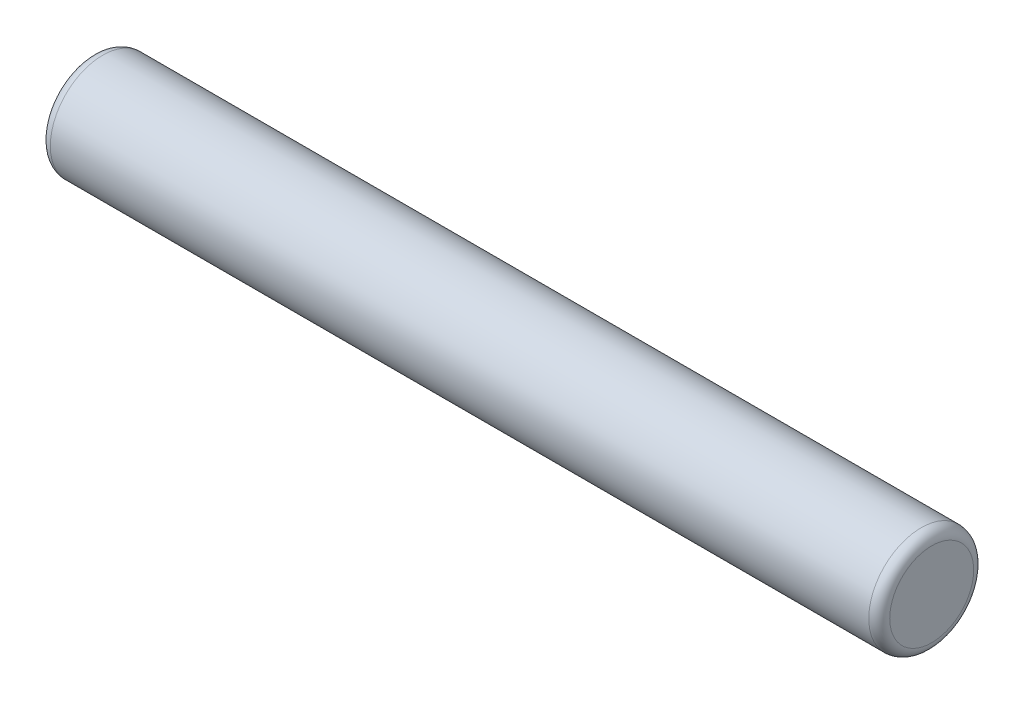
ISO-10303-21;
HEADER;
FILE_DESCRIPTION(('STEP AP214'),'2;1');
FILE_NAME('part.step','',(''),(''),'','','');
FILE_SCHEMA(('AUTOMOTIVE_DESIGN { 1 0 10303 214 1 1 1 1 }'));
ENDSEC;
DATA;
#1=APPLICATION_CONTEXT('core data for automotive mechanical design processes');
#2=APPLICATION_PROTOCOL_DEFINITION('international standard','automotive_design',2000,#1);
#3=PRODUCT_CONTEXT('',#1,'mechanical');
#4=PRODUCT('Part','Part','',(#3));
#5=PRODUCT_RELATED_PRODUCT_CATEGORY('part','',(#4));
#6=PRODUCT_DEFINITION_FORMATION('','',#4);
#7=PRODUCT_DEFINITION_CONTEXT('part definition',#1,'design');
#8=PRODUCT_DEFINITION('design','',#6,#7);
#9=PRODUCT_DEFINITION_SHAPE('','',#8);
#10=(LENGTH_UNIT() NAMED_UNIT(*) SI_UNIT(.MILLI.,.METRE.));
#11=(NAMED_UNIT(*) PLANE_ANGLE_UNIT() SI_UNIT($,.RADIAN.));
#12=(NAMED_UNIT(*) SI_UNIT($,.STERADIAN.) SOLID_ANGLE_UNIT());
#13=UNCERTAINTY_MEASURE_WITH_UNIT(LENGTH_MEASURE(1.E-05),#10,'distance_accuracy_value','');
#14=(GEOMETRIC_REPRESENTATION_CONTEXT(3) GLOBAL_UNCERTAINTY_ASSIGNED_CONTEXT((#13)) GLOBAL_UNIT_ASSIGNED_CONTEXT((#10,
#11,#12)) REPRESENTATION_CONTEXT('',''));
#15=CARTESIAN_POINT('',(0.,0.,0.));
#16=DIRECTION('',(0.,0.,1.));
#17=DIRECTION('',(1.,0.,0.));
#18=AXIS2_PLACEMENT_3D('',#15,#16,#17);
#19=CARTESIAN_POINT('',(10.,24.,0.));
#20=DIRECTION('',(-1.,0.,0.));
#21=DIRECTION('',(0.,-1.,0.));
#22=AXIS2_PLACEMENT_3D('',#19,#20,#21);
#23=PLANE('',#22);
#24=CARTESIAN_POINT('',(10.,24.1168813269704,0.993145888279073));
#25=CARTESIAN_POINT('',(10.,24.1277148782153,0.991870978667544));
#26=CARTESIAN_POINT('',(10.,24.1385275480753,0.99041867227362));
#27=CARTESIAN_POINT('',(10.,24.1600995915585,0.987161119156834));
#28=CARTESIAN_POINT('',(10.,24.1708589651818,0.985355872433971));
#29=CARTESIAN_POINT('',(10.,24.1923128827241,0.981394291895155));
#30=CARTESIAN_POINT('',(10.,24.2030074266432,0.979237958079202));
#31=CARTESIAN_POINT('',(10.,24.2243202360235,0.974576533810914));
#32=CARTESIAN_POINT('',(10.,24.2349385014846,0.972071443358578));
#33=CARTESIAN_POINT('',(10.,24.2560873827783,0.966715182596895));
#34=CARTESIAN_POINT('',(10.,24.266617998611,0.963864012287546));
#35=CARTESIAN_POINT('',(10.,24.2875803044325,0.9578186464529));
#36=CARTESIAN_POINT('',(10.,24.2980119944214,0.954624450927603));
#37=CARTESIAN_POINT('',(10.,24.3187652779785,0.947896454673936));
#38=CARTESIAN_POINT('',(10.,24.3290868715466,0.944362653945565));
#39=CARTESIAN_POINT('',(10.,24.3496089096579,0.936959231478396));
#40=CARTESIAN_POINT('',(10.,24.359809354201,0.933089609739598));
#41=CARTESIAN_POINT('',(10.,24.3800781713662,0.925018688909898));
#42=CARTESIAN_POINT('',(10.,24.3901465439882,0.920817389818996));
#43=CARTESIAN_POINT('',(10.,24.410140435847,0.912087613149304));
#44=CARTESIAN_POINT('',(10.,24.4200659550836,0.907559135570515));
#45=CARTESIAN_POINT('',(10.,24.4397635116766,0.898179851130146));
#46=CARTESIAN_POINT('',(10.,24.449535549033,0.893329044268566));
#47=CARTESIAN_POINT('',(10.,24.468915677723,0.883310295628669));
#48=CARTESIAN_POINT('',(10.,24.4785237690567,0.878142353850352));
#49=CARTESIAN_POINT('',(10.,24.4975657171166,0.867494869338329));
#50=CARTESIAN_POINT('',(10.,24.5069995738428,0.862015326604623));
#51=CARTESIAN_POINT('',(10.,24.5256829506777,0.85075050781347));
#52=CARTESIAN_POINT('',(10.,24.5349324707863,0.844965231756023));
#53=CARTESIAN_POINT('',(10.,24.5532372697683,0.833095141335883));
#54=CARTESIAN_POINT('',(10.,24.5622925486415,0.82701032697319));
#55=CARTESIAN_POINT('',(10.,24.5801991685333,0.81454767571419));
#56=CARTESIAN_POINT('',(10.,24.5890505095517,0.808169838817884));
#57=CARTESIAN_POINT('',(10.,24.6065397754962,0.795127972039151));
#58=CARTESIAN_POINT('',(10.,24.6151777004222,0.788463942156724));
#59=CARTESIAN_POINT('',(10.,24.6322308844754,0.774856825415867));
#60=CARTESIAN_POINT('',(10.,24.6406461436026,0.767913738557435));
#61=CARTESIAN_POINT('',(10.,24.6572449847878,0.75375594269588));
#62=CARTESIAN_POINT('',(10.,24.6654285668459,0.746541233692756));
#63=CARTESIAN_POINT('',(10.,24.6815552907083,0.731847919232927));
#64=CARTESIAN_POINT('',(10.,24.6894984325127,0.724369313776222));
#65=CARTESIAN_POINT('',(10.,24.7051357701525,0.70915621468727));
#66=CARTESIAN_POINT('',(10.,24.7128299659879,0.701421721055022));
#67=CARTESIAN_POINT('',(10.,24.7279611725522,0.685705127904497));
#68=CARTESIAN_POINT('',(10.,24.7353981832811,0.677723028386218));
#69=CARTESIAN_POINT('',(10.,24.7500070558949,0.661519770895724));
#70=CARTESIAN_POINT('',(10.,24.7571789177799,0.653298612923508));
#71=CARTESIAN_POINT('',(10.,24.7712498128965,0.636626041947013));
#72=CARTESIAN_POINT('',(10.,24.7781488461283,0.628174628942734));
#73=CARTESIAN_POINT('',(10.,24.7916666962808,0.611050597886841));
#74=CARTESIAN_POINT('',(10.,24.7982855132017,0.602377979835228));
#75=CARTESIAN_POINT('',(10.,24.8112358431377,0.584820825541303));
#76=CARTESIAN_POINT('',(10.,24.8175673561527,0.575936289298992));
#77=CARTESIAN_POINT('',(10.,24.8299362983344,0.557964812407612));
#78=CARTESIAN_POINT('',(10.,24.835973727501,0.548877871758543));
#79=CARTESIAN_POINT('',(10.,24.8477480369553,0.530511316577299));
#80=CARTESIAN_POINT('',(10.,24.853484917243,0.521231702045124));
#81=CARTESIAN_POINT('',(10.,24.8646519857444,0.502489735941337));
#82=CARTESIAN_POINT('',(10.,24.8700821739581,0.493027384369725));
#83=CARTESIAN_POINT('',(10.,24.88063004353,0.473930076710132));
#84=CARTESIAN_POINT('',(10.,24.8857477248882,0.464295120622152));
#85=CARTESIAN_POINT('',(10.,24.8956651006076,0.444862921282133));
#86=CARTESIAN_POINT('',(10.,24.9004647949689,0.435065678030094));
#87=CARTESIAN_POINT('',(10.,24.9097410570615,0.415319395495424));
#88=CARTESIAN_POINT('',(10.,24.9142176247929,0.405370356212793));
#89=CARTESIAN_POINT('',(10.,24.922842840005,0.385331135297401));
#90=CARTESIAN_POINT('',(10.,24.9269914874857,0.37524095366464));
#91=CARTESIAN_POINT('',(10.,24.9349564197207,0.35493025286821));
#92=CARTESIAN_POINT('',(10.,24.9387727044751,0.344709733704542));
#93=CARTESIAN_POINT('',(10.,24.9460688246841,0.324149302234214));
#94=CARTESIAN_POINT('',(10.,24.9495486601388,0.313809389927554));
#95=CARTESIAN_POINT('',(10.,24.9561681554536,0.293021244408331));
#96=CARTESIAN_POINT('',(10.,24.9593078153137,0.282573011195768));
#97=CARTESIAN_POINT('',(10.,24.9652435974128,0.261579412094551));
#98=CARTESIAN_POINT('',(10.,24.9680397196518,0.251034046205898));
#99=CARTESIAN_POINT('',(10.,24.9732854323512,0.229857473994463));
#100=CARTESIAN_POINT('',(10.,24.9757350228114,0.219226267671681));
#101=CARTESIAN_POINT('',(10.,24.9802850488704,0.197889398753872));
#102=CARTESIAN_POINT('',(10.,24.9823854844691,0.187183736158844));
#103=CARTESIAN_POINT('',(10.,24.9862349516059,0.165709418588684));
#104=CARTESIAN_POINT('',(10.,24.987983983144,0.154940763613552));
#105=CARTESIAN_POINT('',(10.,24.9911287692528,0.133351992626838));
#106=CARTESIAN_POINT('',(10.,24.9925245238235,0.122531876615257));
#107=CARTESIAN_POINT('',(10.,24.9949612613883,0.100851770013669));
#108=CARTESIAN_POINT('',(10.,24.9960022443823,0.0899917794236624));
#109=CARTESIAN_POINT('',(10.,24.9977283240846,0.0682435527898366));
#110=CARTESIAN_POINT('',(10.,24.9984134207928,0.057355316746017));
#111=CARTESIAN_POINT('',(10.,24.999426994299,0.0355622586949577));
#112=CARTESIAN_POINT('',(10.,24.999755471097,0.024657436687718));
#113=CARTESIAN_POINT('',(10.,25.0000554530628,0.00284288351361947));
#114=CARTESIAN_POINT('',(10.,25.0000269582305,-0.00806684765323937));
#115=CARTESIAN_POINT('',(10.,24.9996130273699,-0.02987953541674));
#116=CARTESIAN_POINT('',(10.,24.9992275913415,-0.0407824920133818));
#117=CARTESIAN_POINT('',(10.,24.9981001911174,-0.0625699603904702));
#118=CARTESIAN_POINT('',(10.,24.9973582269215,-0.0734544721709169));
#119=CARTESIAN_POINT('',(10.,24.9955185637788,-0.0951933771720768));
#120=CARTESIAN_POINT('',(10.,24.9944208648319,-0.10604777039279));
#121=CARTESIAN_POINT('',(10.,24.9918305684519,-0.128057682907345));
#122=CARTESIAN_POINT('',(10.,24.9903265745558,-0.13921186269736));
#123=CARTESIAN_POINT('',(10.,24.9869429731038,-0.161463090514584));
#124=CARTESIAN_POINT('',(9.99999999999999,24.9850633655212,-0.17256013853772));
#125=CARTESIAN_POINT('',(9.99999999999994,24.9809306727918,-0.194684477054957));
#126=CARTESIAN_POINT('',(9.99999999999989,24.9786775875912,-0.205711767538999));
#127=CARTESIAN_POINT('',(9.9999999999997,24.9738005082765,-0.227684020946009));
#128=CARTESIAN_POINT('',(9.99999999999956,24.9711765140819,-0.238628983851103));
#129=CARTESIAN_POINT('',(9.9999999999991,24.9655606061176,-0.260424112221182));
#130=CARTESIAN_POINT('',(9.99999999999879,24.9625686922411,-0.271274277658674));
#131=CARTESIAN_POINT('',(9.99999999999791,24.9562203539298,-0.292867447507501));
#132=CARTESIAN_POINT('',(9.99999999999733,24.9528639293626,-0.303610451879944));
#133=CARTESIAN_POINT('',(9.9999999999958,24.9457903938396,-0.324977058550749));
#134=CARTESIAN_POINT('',(9.99999999999485,24.9420732827266,-0.335600660797072));
#135=CARTESIAN_POINT('',(9.99999999999241,24.9342826092508,-0.356716358071306));
#136=CARTESIAN_POINT('',(9.99999999999094,24.9302090467068,-0.367208453032314));
#137=CARTESIAN_POINT('',(9.99999999998731,24.9217101116069,-0.388049180440069));
#138=CARTESIAN_POINT('',(9.99999999998516,24.9172847388464,-0.398397812803373));
#139=CARTESIAN_POINT('',(9.99999999997999,24.908087225376,-0.41893982314585));
#140=CARTESIAN_POINT('',(9.99999999997698,24.9033150844391,-0.429133201023402));
#141=CARTESIAN_POINT('',(9.9999999999699,24.8934294717562,-0.449353087394558));
#142=CARTESIAN_POINT('',(9.99999999996582,24.888315999762,-0.459379595766772));
#143=CARTESIAN_POINT('',(9.99999999995639,24.8777535509904,-0.479254318226006));
#144=CARTESIAN_POINT('',(9.99999999995103,24.8723045739445,-0.489102532170326));
#145=CARTESIAN_POINT('',(9.99999999993879,24.8610773233449,-0.508609443986876));
#146=CARTESIAN_POINT('',(9.99999999993191,24.8552990495035,-0.51826814169361));
#147=CARTESIAN_POINT('',(9.99999999991634,24.8434197887655,-0.537385015145901));
#148=CARTESIAN_POINT('',(9.99999999990766,24.8373188015636,-0.546843190701731));
#149=CARTESIAN_POINT('',(9.99999999988821,24.824801065236,-0.565548242398755));
#150=CARTESIAN_POINT('',(9.99999999987745,24.8183843157885,-0.574795118324619));
#151=CARTESIAN_POINT('',(9.99999999985354,24.805242365862,-0.593067034021472));
#152=CARTESIAN_POINT('',(9.99999999984039,24.7985171650462,-0.602092073550222));
#153=CARTESIAN_POINT('',(9.99999999981137,24.7847659747089,-0.619910032429277));
#154=CARTESIAN_POINT('',(9.9999999997955,24.7777399848369,-0.628702951509191));
#155=CARTESIAN_POINT('',(9.99999999976068,24.7633952214184,-0.646046649899311));
#156=CARTESIAN_POINT('',(9.99999999974174,24.7560764475094,-0.654597428909801));
#157=CARTESIAN_POINT('',(9.99999999970042,24.7411544546355,-0.671447103416572));
#158=CARTESIAN_POINT('',(9.99999999967804,24.7335512352978,-0.679745998582713));
#159=CARTESIAN_POINT('',(9.99999999962944,24.718069014274,-0.696082448603346));
#160=CARTESIAN_POINT('',(9.99999999960322,24.7101900122064,-0.704120003096253));
#161=CARTESIAN_POINT('',(9.99999999954654,24.6941652026524,-0.719924612693534));
#162=CARTESIAN_POINT('',(9.99999999951607,24.6860193947774,-0.72769166740393));
#163=CARTESIAN_POINT('',(9.99999999945046,24.6694702545349,-0.742946426514269));
#164=CARTESIAN_POINT('',(9.9999999994153,24.6610669217734,-0.750434130486978));
#165=CARTESIAN_POINT('',(9.99999999933986,24.6440123061088,-0.765121655438437));
#166=CARTESIAN_POINT('',(9.99999999929956,24.6353610228085,-0.772321475955917));
#167=CARTESIAN_POINT('',(9.99999999921335,24.6178203629363,-0.786425029272828));
#168=CARTESIAN_POINT('',(9.99999999916744,24.6089309859658,-0.793328761576257));
#169=CARTESIAN_POINT('',(9.99999999906949,24.590924266915,-0.806832271047876));
#170=CARTESIAN_POINT('',(9.99999999901746,24.5818069244363,-0.813432047684726));
#171=CARTESIAN_POINT('',(9.99999999890675,24.5633546622862,-0.826320124676211));
#172=CARTESIAN_POINT('',(9.99999999884807,24.5540197422184,-0.832608424463651));
#173=CARTESIAN_POINT('',(9.99999999872354,24.5351429607291,-0.844866381448498));
#174=CARTESIAN_POINT('',(9.99999999865768,24.5256010989157,-0.850836038042433));
#175=CARTESIAN_POINT('',(9.99999999851821,24.5063213055812,-0.86244990533641));
#176=CARTESIAN_POINT('',(9.99999999844461,24.4965833736746,-0.868094115396372));
#177=CARTESIAN_POINT('',(9.99999999828907,24.476922535224,-0.879050657073884));
#178=CARTESIAN_POINT('',(9.99999999820714,24.4669996283028,-0.88436298801451));
#179=CARTESIAN_POINT('',(9.99999999803433,24.4469801456783,-0.894649716989252));
#180=CARTESIAN_POINT('',(9.99999999794346,24.4368835696082,-0.899624114309461));
#181=CARTESIAN_POINT('',(9.99999999775215,24.4165282524497,-0.909229306562274));
#182=CARTESIAN_POINT('',(9.99999999765171,24.406269511007,-0.913860100743947));
#183=CARTESIAN_POINT('',(9.99999999744063,24.3856015516664,-0.922772808681275));
#184=CARTESIAN_POINT('',(9.99999999732999,24.3751923334288,-0.927054721649031));
#185=CARTESIAN_POINT('',(9.99999999709781,24.3542352805661,-0.935264786578287));
#186=CARTESIAN_POINT('',(9.99999999697628,24.3436874456178,-0.93919293771508));
#187=CARTESIAN_POINT('',(9.99999999672165,24.3224651773242,-0.946691001416962));
#188=CARTESIAN_POINT('',(9.99999999658855,24.3117907436744,-0.950260913120794));
#189=CARTESIAN_POINT('',(9.99999999631006,24.2903274404696,-0.95703842852688));
#190=CARTESIAN_POINT('',(9.99999999616467,24.2795385706311,-0.960246031331685));
#191=CARTESIAN_POINT('',(9.9999999958609,24.2578586871862,-0.966295272214799));
#192=CARTESIAN_POINT('',(9.99999999570252,24.2469676733193,-0.969136909359925));
#193=CARTESIAN_POINT('',(9.99999999537188,24.225095913337,-0.974450979326108));
#194=CARTESIAN_POINT('',(9.99999999519963,24.2141151669863,-0.976923411178811));
#195=CARTESIAN_POINT('',(9.99999999484094,24.1920764448468,-0.981496250831506));
#196=CARTESIAN_POINT('',(9.99999999465451,24.1810184688498,-0.983596657628632));
#197=CARTESIAN_POINT('',(9.99999999426492,24.1588379193512,-0.987423054073632));
#198=CARTESIAN_POINT('',(9.99999999406177,24.1477153456708,-0.989149042684898));
#199=CARTESIAN_POINT('',(9.99999999364443,24.1254181531271,-0.992224625777455));
#200=CARTESIAN_POINT('',(9.99999999343024,24.1142435341161,-0.993574219189232));
#201=CARTESIAN_POINT('',(9.99999999302044,24.0944925425736,-0.99562207729656));
#202=CARTESIAN_POINT('',(9.99999999283235,24.0859242398395,-0.996398882340927));
#203=CARTESIAN_POINT('',(9.99999999249353,24.0687705545729,-0.997731023844671));
#204=CARTESIAN_POINT('',(9.9999999923428,24.0601851720016,-0.998286359801242));
#205=CARTESIAN_POINT('',(9.99999999160524,24.0344120972049,-0.999620520711632));
#206=CARTESIAN_POINT('',(9.99999999073305,24.017206111516,-1.00006764019046));
#207=CARTESIAN_POINT('',(9.99999999101971,23.980473923702,-1.00006750038262));
#208=CARTESIAN_POINT('',(9.99999999246825,23.9609476853579,-0.999491519943932));
#209=CARTESIAN_POINT('',(9.99999999612376,23.9219643493378,-0.997185132161475));
#210=CARTESIAN_POINT('',(9.99999999833069,23.9025072489559,-0.995454770509595));
#211=CARTESIAN_POINT('',(10.,23.8831186730295,-0.993145888279071));
#212=B_SPLINE_CURVE_WITH_KNOTS('',3,(#24,#25,#26,#27,#28,#29,#30,#31,#32,#33,#34,#35,#36,#37,
#38,#39,#40,#41,#42,#43,#44,#45,#46,#47,#48,#49,#50,#51,#52,#53,#54,#55,#56,#57,#58,#59,#60,#61,
#62,#63,#64,#65,#66,#67,#68,#69,#70,#71,#72,#73,#74,#75,#76,#77,#78,#79,#80,#81,#82,#83,#84,#85,
#86,#87,#88,#89,#90,#91,#92,#93,#94,#95,#96,#97,#98,#99,#100,#101,#102,#103,#104,#105,#106,#107,
#108,#109,#110,#111,#112,#113,#114,#115,#116,#117,#118,#119,#120,#121,#122,#123,#124,#125,#126,
#127,#128,#129,#130,#131,#132,#133,#134,#135,#136,#137,#138,#139,#140,#141,#142,#143,#144,#145,
#146,#147,#148,#149,#150,#151,#152,#153,#154,#155,#156,#157,#158,#159,#160,#161,#162,#163,#164,
#165,#166,#167,#168,#169,#170,#171,#172,#173,#174,#175,#176,#177,#178,#179,#180,#181,#182,#183,
#184,#185,#186,#187,#188,#189,#190,#191,#192,#193,#194,#195,#196,#197,#198,#199,#200,#201,#202,
#203,#204,#205,#206,#207,#208,#209,#210,#211),.UNSPECIFIED.,.F.,.F.,(4,2,2,2,2,2,2,2,2,2,2,2,2,
2,2,2,2,2,2,2,2,2,2,2,2,2,2,2,2,2,2,2,2,2,2,2,2,2,2,2,2,2,2,2,2,2,2,2,2,2,2,2,2,2,2,2,2,2,2,2,2,
2,2,2,2,2,2,2,2,2,2,2,2,2,2,2,2,2,2,2,2,2,2,2,2,2,2,2,2,2,2,2,2,4),(0.,0.0327234632529742,
0.0654469265059464,0.0981703897589191,0.130893853011895,0.163617316264867,0.19634077951784,
0.229064242770814,0.261787706023786,0.294511169276762,0.327234632529734,0.359958095782709,
0.392681559035681,0.425405022288655,0.458128485541631,0.490851948794602,0.523575412047575,
0.556298875300549,0.589022338553524,0.621745801806496,0.654469265059471,0.687192728312445,
0.719916191565416,0.75263965481839,0.785363118071366,0.818086581324338,0.850810044577312,
0.883533507830285,0.916256971083259,0.948980434336233,0.981703897589206,1.01442736084218,
1.04715082409515,1.07987428734813,1.1125977506011,1.14532121385407,1.17804467710705,
1.21076814036002,1.243491603613,1.27621506686597,1.30893853011894,1.34166199337192,
1.37438545662489,1.40710891987787,1.43983238313084,1.47255584638381,1.50527930963679,
1.53800277288976,1.57072623614273,1.60448514718748,1.63824406063912,1.67200297895876,
1.7057619046075,1.73952084004646,1.77327978773674,1.80703875013944,1.84079772971567,
1.87455672892653,1.90831575023314,1.9420747960966,1.97583386897802,2.00959297133849,
2.04335210563913,2.07711127434104,2.11087047990533,2.14462972479311,2.17838901146548,
2.21214834238354,2.2459077200084,2.27966714680118,2.31342662522296,2.34718615773487,
2.38094574679801,2.41470539487347,2.44846510442237,2.48222487790582,2.51598471778491,
2.54974462652076,2.58350460657446,2.61726466040714,2.65102479047988,2.68478499925381,
2.71854528919001,2.75230566274961,2.7860661223937,2.81982667058338,2.85358730977977,
2.88734804244398,2.92110887103709,2.94691636910656,2.9727239257671,3.02433492299293,
3.08290482524613,3.14147240936486),.UNSPECIFIED.);
#213=CARTESIAN_POINT('',(10.,24.1168813269704,0.993145888279073));
#214=VERTEX_POINT('',#213);
#215=CARTESIAN_POINT('',(10.,23.8831186730295,-0.99314588827907));
#216=VERTEX_POINT('',#215);
#217=EDGE_CURVE('E44',#214,#216,#212,.T.);
#218=ORIENTED_EDGE('',*,*,#217,.F.);
#219=CARTESIAN_POINT('',(10.,24.,0.));
#220=DIRECTION('',(1.,0.,0.));
#221=DIRECTION('',(0.,0.,-1.));
#222=AXIS2_PLACEMENT_3D('',#219,#220,#221);
#223=CIRCLE('',#222,1.);
#224=EDGE_CURVE('E22',#216,#214,#223,.F.);
#225=ORIENTED_EDGE('',*,*,#224,.F.);
#226=EDGE_LOOP('',(#218,#225));
#227=FACE_BOUND('',#226,.T.);
#228=ADVANCED_FACE('F17',(#227),#23,.F.);
#229=CARTESIAN_POINT('',(-9.99999999999999,24.,0.));
#230=DIRECTION('',(-1.,0.,0.));
#231=DIRECTION('',(0.,-1.,0.));
#232=AXIS2_PLACEMENT_3D('',#229,#230,#231);
#233=PLANE('',#232);
#234=CARTESIAN_POINT('',(-9.99999999999999,24.1168813269705,0.993145888279071));
#235=CARTESIAN_POINT('',(-9.99999999935996,24.0974876565408,0.995429254496007));
#236=CARTESIAN_POINT('',(-10.0000000000719,24.0780310142108,0.99714798703943));
#237=CARTESIAN_POINT('',(-9.99999999910781,24.0487961415316,0.998878890068846));
#238=CARTESIAN_POINT('',(-9.99999999844767,24.0390422671222,0.999314659186459));
#239=CARTESIAN_POINT('',(-9.999999995773,24.0195256784421,0.999903660177864));
#240=CARTESIAN_POINT('',(-9.99999999375842,24.0097629639739,1.00005688557353));
#241=CARTESIAN_POINT('',(-9.9999999875249,23.9887130582666,1.00007993237952));
#242=CARTESIAN_POINT('',(-9.99999998301094,23.9774257830532,0.999901781462006));
#243=CARTESIAN_POINT('',(-9.99999997291635,23.9548634599917,0.999161758637887));
#244=CARTESIAN_POINT('',(-9.99999996733569,23.9435884125972,0.9985998729495));
#245=CARTESIAN_POINT('',(-9.99999995535385,23.9210635015039,0.997093781683018));
#246=CARTESIAN_POINT('',(-9.99999994895265,23.9098136386378,0.996149563645961));
#247=CARTESIAN_POINT('',(-9.99999993579545,23.8873521461896,0.993879669065463));
#248=CARTESIAN_POINT('',(-9.99999992903944,23.8761405177358,0.992553981360478));
#249=CARTESIAN_POINT('',(-9.99999991531231,23.8534191950634,0.989475388274012));
#250=CARTESIAN_POINT('',(-9.99999990834105,23.8419111321319,0.987710429534887));
#251=CARTESIAN_POINT('',(-9.99999989474967,23.8189636013232,0.983778659620629));
#252=CARTESIAN_POINT('',(-9.99999988812954,23.8075241350442,0.981611839120336));
#253=CARTESIAN_POINT('',(-9.99999987554004,23.7847278449916,0.976878993456381));
#254=CARTESIAN_POINT('',(-9.99999986957068,23.7733710228481,0.974312960440953));
#255=CARTESIAN_POINT('',(-9.99999985853346,23.750753994244,0.96878482854159));
#256=CARTESIAN_POINT('',(-9.99999985346563,23.7394937893451,0.965822723268327));
#257=CARTESIAN_POINT('',(-9.99999984443151,23.7170838421887,0.959506076320267));
#258=CARTESIAN_POINT('',(-9.99999984046524,23.7059341013244,0.956151529702459));
#259=CARTESIAN_POINT('',(-9.99999983378403,23.6837587949429,0.949054114713497));
#260=CARTESIAN_POINT('',(-9.9999998310691,23.6727332305517,0.94531124282432));
#261=CARTESIAN_POINT('',(-9.99999982699001,23.6508198363181,0.93744177246706));
#262=CARTESIAN_POINT('',(-9.99999982562585,23.639932007237,0.933315171879485));
#263=CARTESIAN_POINT('',(-9.99999982429735,23.6183074720421,0.924683313326677));
#264=CARTESIAN_POINT('',(-9.99999982433303,23.6075707662287,0.920178054608962));
#265=CARTESIAN_POINT('',(-9.99999982580291,23.5862616824065,0.910794419463106));
#266=CARTESIAN_POINT('',(-9.99999982723713,23.5756893041432,0.905916043612992));
#267=CARTESIAN_POINT('',(-9.99999983145257,23.554721865251,0.895792167304338));
#268=CARTESIAN_POINT('',(-9.99999983423379,23.5443268037208,0.890546668712969));
#269=CARTESIAN_POINT('',(-9.99999984104092,23.5237268131228,0.879695023857114));
#270=CARTESIAN_POINT('',(-9.99999984506682,23.5135218824166,0.874088880702549));
#271=CARTESIAN_POINT('',(-9.99999985421235,23.493314567727,0.862522758179329));
#272=CARTESIAN_POINT('',(-9.99999985933197,23.4833121812824,0.856562783113668));
#273=CARTESIAN_POINT('',(-9.99999986919296,23.4657715654666,0.845690556936694));
#274=CARTESIAN_POINT('',(-9.99999987375582,23.4581899876878,0.840848064698152));
#275=CARTESIAN_POINT('',(-9.99999988330535,23.4431606776198,0.830959769645998));
#276=CARTESIAN_POINT('',(-9.99999988829201,23.4357129434262,0.82591396972843));
#277=CARTESIAN_POINT('',(-9.9999998985209,23.4209567904779,0.815622811164018));
#278=CARTESIAN_POINT('',(-9.99999990376313,23.4136483694471,0.810377455781596));
#279=CARTESIAN_POINT('',(-9.99999991448905,23.3991764701028,0.799691050709071));
#280=CARTESIAN_POINT('',(-9.99999991997273,23.3920129891157,0.794250004633932));
#281=CARTESIAN_POINT('',(-9.99999993425349,23.3727916156067,0.779236804168159));
#282=CARTESIAN_POINT('',(-9.99999994263231,23.3608774174341,0.76947958320947));
#283=CARTESIAN_POINT('',(-9.9999999568019,23.3383614159711,0.750155313770729));
#284=CARTESIAN_POINT('',(-9.99999996273652,23.3277271630048,0.740625984439839));
#285=CARTESIAN_POINT('',(-9.99999997274027,23.3076931221806,0.721885411763384));
#286=CARTESIAN_POINT('',(-9.99999997691915,23.2982619034134,0.712707767963249));
#287=CARTESIAN_POINT('',(-9.99999998377934,23.2805549401143,0.694783871028502));
#288=CARTESIAN_POINT('',(-9.99999998655777,23.2722491336892,0.686067290569588));
#289=CARTESIAN_POINT('',(-9.99999999100176,23.256714205237,0.66916391896563));
#290=CARTESIAN_POINT('',(-9.99999999274674,23.2494567534629,0.661003165422852));
#291=CARTESIAN_POINT('',(-9.99999999544128,23.2359424027366,0.645297059499497));
#292=CARTESIAN_POINT('',(-9.99999999645402,23.2296591663898,0.637774303719506));
#293=CARTESIAN_POINT('',(-9.99999999854598,23.2132573459281,0.617540625923353));
#294=CARTESIAN_POINT('',(-9.99999999923113,23.2033333133097,0.604670629904098));
#295=CARTESIAN_POINT('',(-9.99999999973656,23.1896020776504,0.585941733368461));
#296=CARTESIAN_POINT('',(-9.99999999982725,23.1855349121842,0.580271378437221));
#297=CARTESIAN_POINT('',(-9.99999999989689,23.1782842325874,0.569937619363773));
#298=CARTESIAN_POINT('',(-9.99999999989388,23.175080238211,0.565288614429244));
#299=CARTESIAN_POINT('',(-9.99999999995267,23.1678242668409,0.554572275940645));
#300=CARTESIAN_POINT('',(-10.0000000000337,23.1637981021769,0.548487484692339));
#301=CARTESIAN_POINT('',(-9.99999999872038,23.15397049377,0.533292452635622));
#302=CARTESIAN_POINT('',(-9.99999999659879,23.1482451308385,0.524132722178782));
#303=CARTESIAN_POINT('',(-9.99999999225901,23.1398867444736,0.51025507554585));
#304=CARTESIAN_POINT('',(-9.99999999061945,23.1371388095693,0.505606037098066));
#305=CARTESIAN_POINT('',(-9.99999998698414,23.1317185210067,0.496264063003469));
#306=CARTESIAN_POINT('',(-9.99999998498839,23.1290461687431,0.491571126548752));
#307=CARTESIAN_POINT('',(-9.99999997639656,23.1184382190148,0.472584802800088));
#308=CARTESIAN_POINT('',(-9.99999996867619,23.1108149804588,0.458114973457869));
#309=CARTESIAN_POINT('',(-9.99999995240295,23.0962897157636,0.428818069496278));
#310=CARTESIAN_POINT('',(-9.99999994385003,23.0893877214322,0.413990979156655));
#311=CARTESIAN_POINT('',(-9.99999992729545,23.0763212911968,0.384014380960731));
#312=CARTESIAN_POINT('',(-9.9999999192938,23.0701568813049,0.368864861755592));
#313=CARTESIAN_POINT('',(-9.99999990491001,23.0585807924573,0.338280529350725));
#314=CARTESIAN_POINT('',(-9.99999989852791,23.0531691334012,0.322845708620999));
#315=CARTESIAN_POINT('',(-9.99999988813816,23.0431117094387,0.29172821464678));
#316=CARTESIAN_POINT('',(-9.99999988413055,23.0384659580185,0.276045537043325));
#317=CARTESIAN_POINT('',(-9.99999987893021,23.0299516746577,0.244470409949741));
#318=CARTESIAN_POINT('',(-9.99999987773751,23.0260831495431,0.228577958618595));
#319=CARTESIAN_POINT('',(-9.99999987829553,23.0191327605559,0.196622142495215));
#320=CARTESIAN_POINT('',(-9.99999988004626,23.0160508966503,0.180558777710133));
#321=CARTESIAN_POINT('',(-9.99999988629842,23.0106812316129,0.148299331470517));
#322=CARTESIAN_POINT('',(-9.99999989079982,23.0083934234412,0.132103251193868));
#323=CARTESIAN_POINT('',(-9.99999989934123,23.0055330177582,0.107494957667745));
#324=CARTESIAN_POINT('',(-9.99999990254683,23.0046666078612,0.0991159561407063));
#325=CARTESIAN_POINT('',(-9.99999990941415,23.0031464388701,0.0823389132839518));
#326=CARTESIAN_POINT('',(-9.99999991307586,23.0024926773403,0.073940872173422));
#327=CARTESIAN_POINT('',(-9.99999992481577,23.000851497924,0.0487258291056831));
#328=CARTESIAN_POINT('',(-9.99999993364934,23.0001839861165,0.0318861949378577));
#329=CARTESIAN_POINT('',(-9.99999994385517,22.9998840172756,0.0109522392982336));
#330=CARTESIAN_POINT('',(-9.99999994581306,22.9998505386523,0.00686074965349455));
#331=CARTESIAN_POINT('',(-9.99999994953913,22.9998324118271,-0.00176425765907683));
#332=CARTESIAN_POINT('',(-9.99999995126399,22.9998534273555,-0.00629779476323189));
#333=CARTESIAN_POINT('',(-9.99999995666946,23.0000276940656,-0.0215755551248848));
#334=CARTESIAN_POINT('',(-9.99999995979166,23.0003226755705,-0.0323184637169179));
#335=CARTESIAN_POINT('',(-9.99999996568367,23.0013394707848,-0.0556667809813299));
#336=CARTESIAN_POINT('',(-9.99999996829636,23.0021269105552,-0.0682693351718537));
#337=CARTESIAN_POINT('',(-9.99999997319423,23.0043301931314,-0.0953089600608212));
#338=CARTESIAN_POINT('',(-9.99999997537279,23.0058221247795,-0.109739882895864));
#339=CARTESIAN_POINT('',(-9.99999997941385,23.0096652744183,-0.140387798639853));
#340=CARTESIAN_POINT('',(-9.99999998119884,23.0121027732579,-0.156593981090384));
#341=CARTESIAN_POINT('',(-9.99999998448326,23.0180956754825,-0.190719142077337));
#342=CARTESIAN_POINT('',(-9.99999998592646,23.0217472239676,-0.208621406346411));
#343=CARTESIAN_POINT('',(-9.9999999878501,23.0281142871142,-0.235989212912235));
#344=CARTESIAN_POINT('',(-9.99999998846753,23.0304843981477,-0.245536539946748));
#345=CARTESIAN_POINT('',(-9.99999998963689,23.0356250671053,-0.265011720787893));
#346=CARTESIAN_POINT('',(-9.99999999018428,23.0384093442608,-0.274935970465635));
#347=CARTESIAN_POINT('',(-9.99999999121867,23.0444170611169,-0.295143964054158));
#348=CARTESIAN_POINT('',(-9.99999999170179,23.0476547339596,-0.305423474103431));
#349=CARTESIAN_POINT('',(-9.99999999261225,23.054608851697,-0.326318333886343));
#350=CARTESIAN_POINT('',(-9.99999999303624,23.0583400153844,-0.336928788095041));
#351=CARTESIAN_POINT('',(-9.99999999383302,23.0663212731647,-0.358458376463635));
#352=CARTESIAN_POINT('',(-9.99999999420293,23.070586533752,-0.369371889948841));
#353=CARTESIAN_POINT('',(-9.99999999489592,23.079676451107,-0.391476873132815));
#354=CARTESIAN_POINT('',(-9.99999999521654,23.0845166805299,-0.402661941348477));
#355=CARTESIAN_POINT('',(-9.99999999581517,23.094796994786,-0.42527546002092));
#356=CARTESIAN_POINT('',(-9.99999999609107,23.1002530111977,-0.436696670079029));
#357=CARTESIAN_POINT('',(-9.99999999660433,23.1118050139634,-0.45974384102775));
#358=CARTESIAN_POINT('',(-9.99999999683987,23.1179172380452,-0.471361665436661));
#359=CARTESIAN_POINT('',(-9.99999999727627,23.1308210479791,-0.494759165732917));
#360=CARTESIAN_POINT('',(-9.99999999747559,23.1376291189632,-0.506529752541217));
#361=CARTESIAN_POINT('',(-9.99999999784323,23.1519628769959,-0.530185425814703));
#362=CARTESIAN_POINT('',(-9.99999999801024,23.1595052316238,-0.542060415527435));
#363=CARTESIAN_POINT('',(-9.99999999831674,23.1753442202301,-0.56587292978307));
#364=CARTESIAN_POINT('',(-9.99999999845513,23.1836576328137,-0.577799296823125));
#365=CARTESIAN_POINT('',(-9.99999999870767,23.2010733176292,-0.601657858757616));
#366=CARTESIAN_POINT('',(-9.99999999882091,23.2101924014065,-0.613577785012383));
#367=CARTESIAN_POINT('',(-9.99999999902624,23.2292513956633,-0.637361923722702));
#368=CARTESIAN_POINT('',(-9.99999999911756,23.2392080657242,-0.649212709430888));
#369=CARTESIAN_POINT('',(-9.99999999928196,23.2599710188904,-0.672792141130002));
#370=CARTESIAN_POINT('',(-9.9999999993544,23.2707939177964,-0.684506159495489));
#371=CARTESIAN_POINT('',(-9.99999999948371,23.2933143309714,-0.707740745986381));
#372=CARTESIAN_POINT('',(-9.99999999954005,23.3050282184936,-0.719245447870232));
#373=CARTESIAN_POINT('',(-9.99999999963965,23.3293511916429,-0.741985262291698));
#374=CARTESIAN_POINT('',(-9.99999999968248,23.3419763023307,-0.753203238158523));
#375=CARTESIAN_POINT('',(-9.99999999975731,23.3681372160468,-0.775288750590851));
#376=CARTESIAN_POINT('',(-9.99999999978897,23.3816885834496,-0.786137855060501));
#377=CARTESIAN_POINT('',(-9.99999999984352,23.4097117356966,-0.807400256352538));
#378=CARTESIAN_POINT('',(-9.99999999986615,23.4241985054971,-0.817793808575014));
#379=CARTESIAN_POINT('',(-9.99999999990446,23.4540956639062,-0.838055469484737));
#380=CARTESIAN_POINT('',(-9.99999999991995,23.4695203319554,-0.84790251240102));
#381=CARTESIAN_POINT('',(-9.99999999994561,23.5012894049813,-0.866977658110187));
#382=CARTESIAN_POINT('',(-9.99999999995564,23.5176472563752,-0.876183376630984));
#383=CARTESIAN_POINT('',(-9.9999999999718,23.551270355196,-0.893878733862911));
#384=CARTESIAN_POINT('',(-9.99999999997783,23.5685480668418,-0.902344677650707));
#385=CARTESIAN_POINT('',(-9.99999999998719,23.6039918531332,-0.918461101415593));
#386=CARTESIAN_POINT('',(-9.99999999999044,23.6221693183529,-0.926086617061626));
#387=CARTESIAN_POINT('',(-9.99999999999401,23.649911417856,-0.936772152108999));
#388=CARTESIAN_POINT('',(-9.99999999999498,23.6593226856309,-0.94023545531716));
#389=CARTESIAN_POINT('',(-9.99999999999659,23.6783562692272,-0.946916485637159));
#390=CARTESIAN_POINT('',(-9.99999999999721,23.6879797658826,-0.950130861213539));
#391=CARTESIAN_POINT('',(-9.99999999999823,23.707431986213,-0.956300776025323));
#392=CARTESIAN_POINT('',(-9.9999999999986,23.7172617959884,-0.959252887804706));
#393=CARTESIAN_POINT('',(-9.99999999999919,23.7371206506543,-0.964885209438611));
#394=CARTESIAN_POINT('',(-9.99999999999939,23.7471506882082,-0.967561920750272));
#395=CARTESIAN_POINT('',(-9.99999999999969,23.7674031740909,-0.972630298608895));
#396=CARTESIAN_POINT('',(-9.99999999999979,23.7776265153984,-0.975018397064263));
#397=CARTESIAN_POINT('',(-9.99999999999991,23.7982581075318,-0.979496450731595));
#398=CARTESIAN_POINT('',(-9.99999999999994,23.8086671474232,-0.981582771133219));
#399=CARTESIAN_POINT('',(-9.99999999999998,23.8296618983613,-0.985444193688596));
#400=CARTESIAN_POINT('',(-9.99999999999999,23.8402482898532,-0.987215596786865));
#401=CARTESIAN_POINT('',(-9.99999999999999,23.8615887467461,-0.990434295852538));
#402=CARTESIAN_POINT('',(-9.99999999999999,23.8723433792326,-0.991877832664615));
#403=CARTESIAN_POINT('',(-9.99999999999999,23.8831186730296,-0.993145888279073));
#404=B_SPLINE_CURVE_WITH_KNOTS('',3,(#234,#235,#236,#237,#238,#239,#240,#241,#242,#243,#244,
#245,#246,#247,#248,#249,#250,#251,#252,#253,#254,#255,#256,#257,#258,#259,#260,#261,#262,#263,
#264,#265,#266,#267,#268,#269,#270,#271,#272,#273,#274,#275,#276,#277,#278,#279,#280,#281,#282,
#283,#284,#285,#286,#287,#288,#289,#290,#291,#292,#293,#294,#295,#296,#297,#298,#299,#300,#301,
#302,#303,#304,#305,#306,#307,#308,#309,#310,#311,#312,#313,#314,#315,#316,#317,#318,#319,#320,
#321,#322,#323,#324,#325,#326,#327,#328,#329,#330,#331,#332,#333,#334,#335,#336,#337,#338,#339,
#340,#341,#342,#343,#344,#345,#346,#347,#348,#349,#350,#351,#352,#353,#354,#355,#356,#357,#358,
#359,#360,#361,#362,#363,#364,#365,#366,#367,#368,#369,#370,#371,#372,#373,#374,#375,#376,#377,
#378,#379,#380,#381,#382,#383,#384,#385,#386,#387,#388,#389,#390,#391,#392,#393,#394,#395,#396,
#397,#398,#399,#400,#401,#402,#403),.UNSPECIFIED.,.F.,.F.,(4,2,2,2,2,2,2,2,2,2,2,2,2,2,2,2,2,2,
2,2,2,2,2,2,2,2,2,2,2,2,2,2,2,2,2,2,2,2,2,2,2,2,2,2,2,2,2,2,2,2,2,2,2,2,2,2,2,2,2,2,2,2,2,2,2,2,
2,2,2,2,2,2,2,2,2,2,2,2,2,2,2,2,2,2,4),(0.,0.0585668299155976,0.0878538309460087,
0.117141503456677,0.151000918898188,0.184861550459597,0.218723285517172,0.252586011447036,
0.287506694077796,0.322428187140723,0.357350367131283,0.392273110544805,0.427196293876486,
0.462119793621404,0.497043486274519,0.531967248330669,0.566890956284579,0.601814486630862,
0.636737715864013,0.671660520478424,0.69864573546808,0.725630566199022,0.75261495568924,
0.779598846956693,0.825780162848393,0.868605039027044,0.908073723575902,0.944186437136543,
0.976943372909491,1.00634469665737,1.0550774592453,1.0760108816903,1.09294843114573,
1.1148356800771,1.14723494696892,1.16343559508691,1.17963654195218,1.22867967460654,
1.2777249692193,1.32677199299079,1.37582031312003,1.42486949680485,1.47391911124194,
1.52296872362689,1.57201790115428,1.59728649624099,1.62255480189528,1.67308624672749,
1.68536103656089,1.69896140518012,1.73119637823733,1.76906890901701,1.81257855642433,
1.86172485049937,1.91650729246158,1.94601510523286,1.97693223704558,2.00925866351439,
2.04299436055475,2.07813930438308,2.11469347151689,2.1526568387749,2.1920293832771,
2.23281108244484,2.27500191400088,2.31860185596943,2.36361088667619,2.41002898474838,
2.45785612911473,2.50709229900556,2.55773747395269,2.60979163378956,2.66325475865114,
2.71812682897398,2.77440782549616,2.83209772925732,2.89119652159866,2.92127764692211,
2.95171110850206,2.98249690692502,3.01363504282913,3.04512551690422,3.07696832989175,
3.10916348258488,3.14171097582839),.UNSPECIFIED.);
#405=CARTESIAN_POINT('',(-9.99999999999999,24.1168813269705,0.993145888279075));
#406=VERTEX_POINT('',#405);
#407=CARTESIAN_POINT('',(-9.99999999999999,23.8831186730296,-0.993145888279077));
#408=VERTEX_POINT('',#407);
#409=EDGE_CURVE('E47',#406,#408,#404,.T.);
#410=ORIENTED_EDGE('',*,*,#409,.F.);
#411=CARTESIAN_POINT('',(-9.99999999999999,24.1168813269705,0.993145888279071));
#412=CARTESIAN_POINT('',(-9.99999999999999,24.2584127652886,0.976489340118434));
#413=CARTESIAN_POINT('',(-9.99999999999999,24.3902869226098,0.920693281196183));
#414=CARTESIAN_POINT('',(-9.99999999999999,24.5571895477422,0.850076650194798));
#415=CARTESIAN_POINT('',(-9.99999999999999,24.6893925945438,0.724387914440989));
#416=CARTESIAN_POINT('',(-9.99999999999999,24.8500799077427,0.571618475791344));
#417=CARTESIAN_POINT('',(-9.99999999999999,24.9313081729382,0.364232188333874));
#418=CARTESIAN_POINT('',(-9.99999999999999,25.0222939074362,0.13193381727178));
#419=CARTESIAN_POINT('',(-9.99999999999999,24.9931458882791,-0.116881326970448));
#420=CARTESIAN_POINT('',(-9.99999999999999,24.9641180991444,-0.364670156175806));
#421=CARTESIAN_POINT('',(-9.99999999999999,24.8213022181425,-0.570493353575841));
#422=CARTESIAN_POINT('',(-9.99999999999999,24.6949051990148,-0.752654037921318));
#423=CARTESIAN_POINT('',(-9.99999999999999,24.5023824713911,-0.864645506805527));
#424=CARTESIAN_POINT('',(-9.99999999999999,24.3457375345775,-0.955766678750078));
#425=CARTESIAN_POINT('',(-9.99999999999999,24.1658747748265,-0.986146824299636));
#426=CARTESIAN_POINT('',(-9.99999999999999,24.0253419377365,-1.00988385608542));
#427=CARTESIAN_POINT('',(-9.99999999999999,23.8831186730296,-0.993145888279073));
#428=B_SPLINE_CURVE_WITH_KNOTS('',2,(#411,#412,#413,#414,#415,#416,#417,#418,#419,#420,#421,
#422,#423,#424,#425,#426,#427),.UNSPECIFIED.,.F.,.F.,(3,2,2,2,2,2,2,2,3),(0.,0.125,0.25,0.375,
0.5,0.625,0.75,0.875,1.),.UNSPECIFIED.);
#429=EDGE_CURVE('E36',#406,#408,#428,.T.);
#430=ORIENTED_EDGE('',*,*,#429,.T.);
#431=EDGE_LOOP('',(#410,#430));
#432=FACE_BOUND('',#431,.T.);
#433=ADVANCED_FACE('F63',(#432),#233,.T.);
#434=CARTESIAN_POINT('',(9.75000000000001,24.,0.));
#435=DIRECTION('',(1.,0.,0.));
#436=DIRECTION('',(0.,0.,-1.));
#437=AXIS2_PLACEMENT_3D('',#434,#435,#436);
#438=TOROIDAL_SURFACE('',#437,0.999999999999999,0.250000000000003);
#439=CARTESIAN_POINT('',(9.75000000000001,24.,0.));
#440=DIRECTION('',(-1.,0.,0.));
#441=DIRECTION('',(0.,-1.,0.));
#442=AXIS2_PLACEMENT_3D('',#439,#440,#441);
#443=CIRCLE('',#442,1.25);
#444=CARTESIAN_POINT('',(9.75000000000001,22.75,0.));
#445=VERTEX_POINT('',#444);
#446=EDGE_CURVE('E28',#445,#445,#443,.T.);
#447=ORIENTED_EDGE('',*,*,#446,.F.);
#448=EDGE_LOOP('',(#447));
#449=FACE_BOUND('',#448,.T.);
#450=ORIENTED_EDGE('',*,*,#224,.T.);
#451=ORIENTED_EDGE('',*,*,#217,.T.);
#452=EDGE_LOOP('',(#450,#451));
#453=FACE_BOUND('',#452,.T.);
#454=ADVANCED_FACE('F48',(#449,#453),#438,.T.);
#455=CARTESIAN_POINT('',(-9.74999999999999,24.,0.));
#456=DIRECTION('',(-1.,0.,0.));
#457=DIRECTION('',(0.,0.,1.));
#458=AXIS2_PLACEMENT_3D('',#455,#456,#457);
#459=TOROIDAL_SURFACE('',#458,0.999999999999999,0.250000000000001);
#460=ORIENTED_EDGE('',*,*,#409,.T.);
#461=ORIENTED_EDGE('',*,*,#429,.F.);
#462=EDGE_LOOP('',(#460,#461));
#463=FACE_BOUND('',#462,.T.);
#464=CARTESIAN_POINT('',(-9.74999999999999,24.,0.));
#465=DIRECTION('',(-1.,0.,0.));
#466=DIRECTION('',(0.,-1.,0.));
#467=AXIS2_PLACEMENT_3D('',#464,#465,#466);
#468=CIRCLE('',#467,1.25);
#469=CARTESIAN_POINT('',(-9.74999999999999,22.75,0.));
#470=VERTEX_POINT('',#469);
#471=EDGE_CURVE('E11',#470,#470,#468,.F.);
#472=ORIENTED_EDGE('',*,*,#471,.F.);
#473=EDGE_LOOP('',(#472));
#474=FACE_BOUND('',#473,.T.);
#475=ADVANCED_FACE('F19',(#463,#474),#459,.T.);
#476=CARTESIAN_POINT('',(0.,24.,0.));
#477=DIRECTION('',(-1.,0.,0.));
#478=DIRECTION('',(0.,-1.,0.));
#479=AXIS2_PLACEMENT_3D('',#476,#477,#478);
#480=CYLINDRICAL_SURFACE('',#479,1.25);
#481=ORIENTED_EDGE('',*,*,#446,.T.);
#482=EDGE_LOOP('',(#481));
#483=FACE_BOUND('',#482,.T.);
#484=ORIENTED_EDGE('',*,*,#471,.T.);
#485=EDGE_LOOP('',(#484));
#486=FACE_BOUND('',#485,.T.);
#487=ADVANCED_FACE('F70',(#483,#486),#480,.T.);
#488=CLOSED_SHELL('',(#228,#433,#454,#475,#487));
#489=MANIFOLD_SOLID_BREP('B1',#488);
#490=ADVANCED_BREP_SHAPE_REPRESENTATION('',(#18,#489),#14);
#491=SHAPE_DEFINITION_REPRESENTATION(#9,#490);
ENDSEC;
END-ISO-10303-21;
